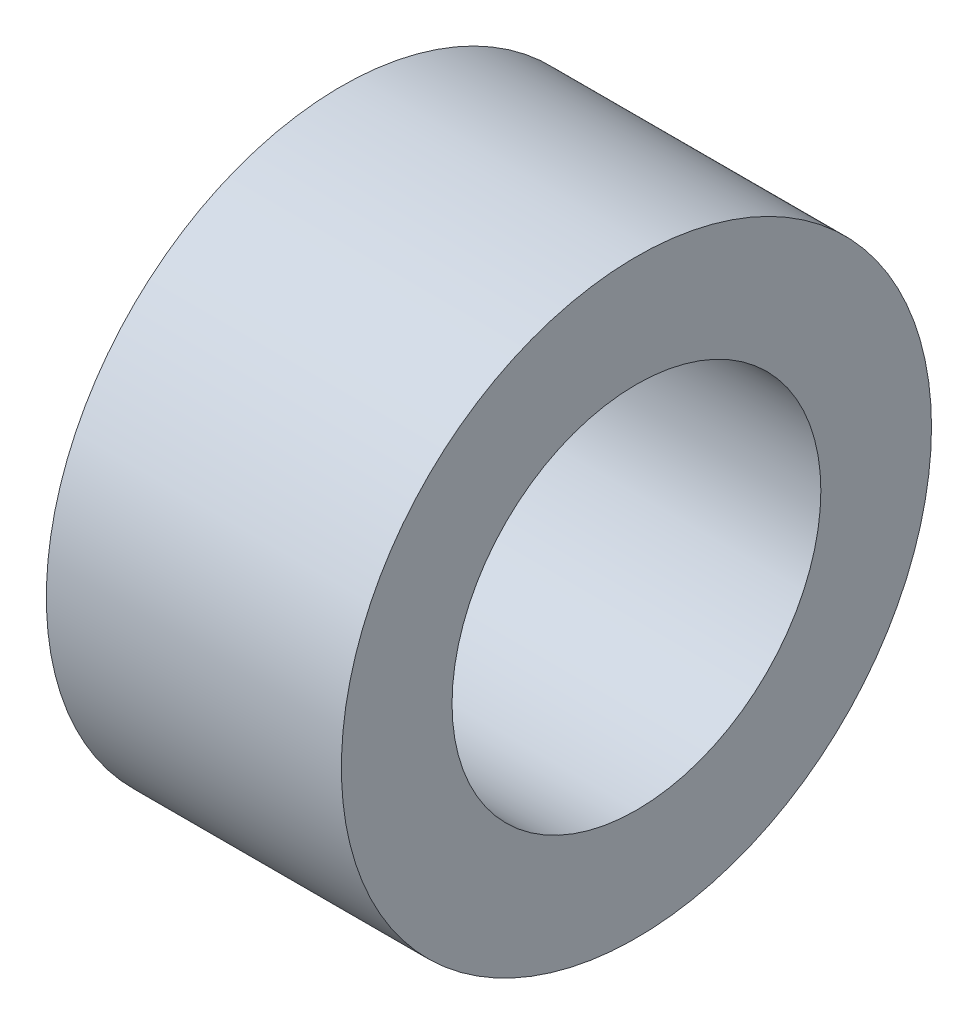
ISO-10303-21;
HEADER;
FILE_DESCRIPTION(('STEP AP214'),'2;1');
FILE_NAME('part.step','',(''),(''),'','','');
FILE_SCHEMA(('AUTOMOTIVE_DESIGN { 1 0 10303 214 1 1 1 1 }'));
ENDSEC;
DATA;
#1=APPLICATION_CONTEXT('core data for automotive mechanical design processes');
#2=APPLICATION_PROTOCOL_DEFINITION('international standard','automotive_design',2000,#1);
#3=PRODUCT_CONTEXT('',#1,'mechanical');
#4=PRODUCT('Part','Part','',(#3));
#5=PRODUCT_RELATED_PRODUCT_CATEGORY('part','',(#4));
#6=PRODUCT_DEFINITION_FORMATION('','',#4);
#7=PRODUCT_DEFINITION_CONTEXT('part definition',#1,'design');
#8=PRODUCT_DEFINITION('design','',#6,#7);
#9=PRODUCT_DEFINITION_SHAPE('','',#8);
#10=(LENGTH_UNIT() NAMED_UNIT(*) SI_UNIT(.MILLI.,.METRE.));
#11=(NAMED_UNIT(*) PLANE_ANGLE_UNIT() SI_UNIT($,.RADIAN.));
#12=(NAMED_UNIT(*) SI_UNIT($,.STERADIAN.) SOLID_ANGLE_UNIT());
#13=UNCERTAINTY_MEASURE_WITH_UNIT(LENGTH_MEASURE(1.E-05),#10,'distance_accuracy_value','');
#14=(GEOMETRIC_REPRESENTATION_CONTEXT(3) GLOBAL_UNCERTAINTY_ASSIGNED_CONTEXT((#13)) GLOBAL_UNIT_ASSIGNED_CONTEXT((#10,
#11,#12)) REPRESENTATION_CONTEXT('',''));
#15=CARTESIAN_POINT('',(0.,0.,0.));
#16=DIRECTION('',(0.,0.,1.));
#17=DIRECTION('',(1.,0.,0.));
#18=AXIS2_PLACEMENT_3D('',#15,#16,#17);
#19=CARTESIAN_POINT('',(2.5,0.,0.));
#20=DIRECTION('',(1.,0.,0.));
#21=DIRECTION('',(0.,0.,-1.));
#22=AXIS2_PLACEMENT_3D('',#19,#20,#21);
#23=PLANE('',#22);
#24=CARTESIAN_POINT('',(2.5,0.,0.));
#25=DIRECTION('',(1.,0.,0.));
#26=DIRECTION('',(0.,0.,-1.));
#27=AXIS2_PLACEMENT_3D('',#24,#25,#26);
#28=CIRCLE('',#27,5.);
#29=CARTESIAN_POINT('',(2.5,0.,-5.));
#30=VERTEX_POINT('',#29);
#31=EDGE_CURVE('E10',#30,#30,#28,.T.);
#32=ORIENTED_EDGE('',*,*,#31,.T.);
#33=EDGE_LOOP('',(#32));
#34=FACE_BOUND('',#33,.T.);
#35=CARTESIAN_POINT('',(2.5,0.,0.));
#36=DIRECTION('',(1.,0.,0.));
#37=DIRECTION('',(0.,0.,-1.));
#38=AXIS2_PLACEMENT_3D('',#35,#36,#37);
#39=CIRCLE('',#38,3.125);
#40=CARTESIAN_POINT('',(2.5,0.,-3.125));
#41=VERTEX_POINT('',#40);
#42=EDGE_CURVE('E42',#41,#41,#39,.T.);
#43=ORIENTED_EDGE('',*,*,#42,.F.);
#44=EDGE_LOOP('',(#43));
#45=FACE_BOUND('',#44,.T.);
#46=ADVANCED_FACE('F31',(#34,#45),#23,.T.);
#47=CARTESIAN_POINT('',(-2.5,0.,0.));
#48=DIRECTION('',(1.,0.,0.));
#49=DIRECTION('',(0.,0.,-1.));
#50=AXIS2_PLACEMENT_3D('',#47,#48,#49);
#51=PLANE('',#50);
#52=CARTESIAN_POINT('',(-2.5,0.,0.));
#53=DIRECTION('',(1.,0.,0.));
#54=DIRECTION('',(0.,0.,-1.));
#55=AXIS2_PLACEMENT_3D('',#52,#53,#54);
#56=CIRCLE('',#55,5.);
#57=CARTESIAN_POINT('',(-2.5,0.,-5.));
#58=VERTEX_POINT('',#57);
#59=EDGE_CURVE('E35',#58,#58,#56,.T.);
#60=ORIENTED_EDGE('',*,*,#59,.F.);
#61=EDGE_LOOP('',(#60));
#62=FACE_BOUND('',#61,.T.);
#63=CARTESIAN_POINT('',(-2.5,0.,0.));
#64=DIRECTION('',(1.,0.,0.));
#65=DIRECTION('',(0.,0.,-1.));
#66=AXIS2_PLACEMENT_3D('',#63,#64,#65);
#67=CIRCLE('',#66,3.125);
#68=CARTESIAN_POINT('',(-2.5,0.,-3.125));
#69=VERTEX_POINT('',#68);
#70=EDGE_CURVE('E44',#69,#69,#67,.T.);
#71=ORIENTED_EDGE('',*,*,#70,.T.);
#72=EDGE_LOOP('',(#71));
#73=FACE_BOUND('',#72,.T.);
#74=ADVANCED_FACE('F54',(#62,#73),#51,.F.);
#75=CARTESIAN_POINT('',(2.5,0.,0.));
#76=DIRECTION('',(-1.,0.,0.));
#77=DIRECTION('',(0.,0.,1.));
#78=AXIS2_PLACEMENT_3D('',#75,#76,#77);
#79=CYLINDRICAL_SURFACE('',#78,5.);
#80=ORIENTED_EDGE('',*,*,#31,.F.);
#81=EDGE_LOOP('',(#80));
#82=FACE_BOUND('',#81,.T.);
#83=ORIENTED_EDGE('',*,*,#59,.T.);
#84=EDGE_LOOP('',(#83));
#85=FACE_BOUND('',#84,.T.);
#86=ADVANCED_FACE('F33',(#82,#85),#79,.T.);
#87=CARTESIAN_POINT('',(2.5,0.,0.));
#88=DIRECTION('',(-1.,0.,0.));
#89=DIRECTION('',(0.,0.,1.));
#90=AXIS2_PLACEMENT_3D('',#87,#88,#89);
#91=CYLINDRICAL_SURFACE('',#90,3.125);
#92=ORIENTED_EDGE('',*,*,#42,.T.);
#93=EDGE_LOOP('',(#92));
#94=FACE_BOUND('',#93,.T.);
#95=ORIENTED_EDGE('',*,*,#70,.F.);
#96=EDGE_LOOP('',(#95));
#97=FACE_BOUND('',#96,.T.);
#98=ADVANCED_FACE('F50',(#94,#97),#91,.F.);
#99=CLOSED_SHELL('',(#46,#74,#86,#98));
#100=MANIFOLD_SOLID_BREP('B2',#99);
#101=ADVANCED_BREP_SHAPE_REPRESENTATION('',(#18,#100),#14);
#102=SHAPE_DEFINITION_REPRESENTATION(#9,#101);
ENDSEC;
END-ISO-10303-21;
